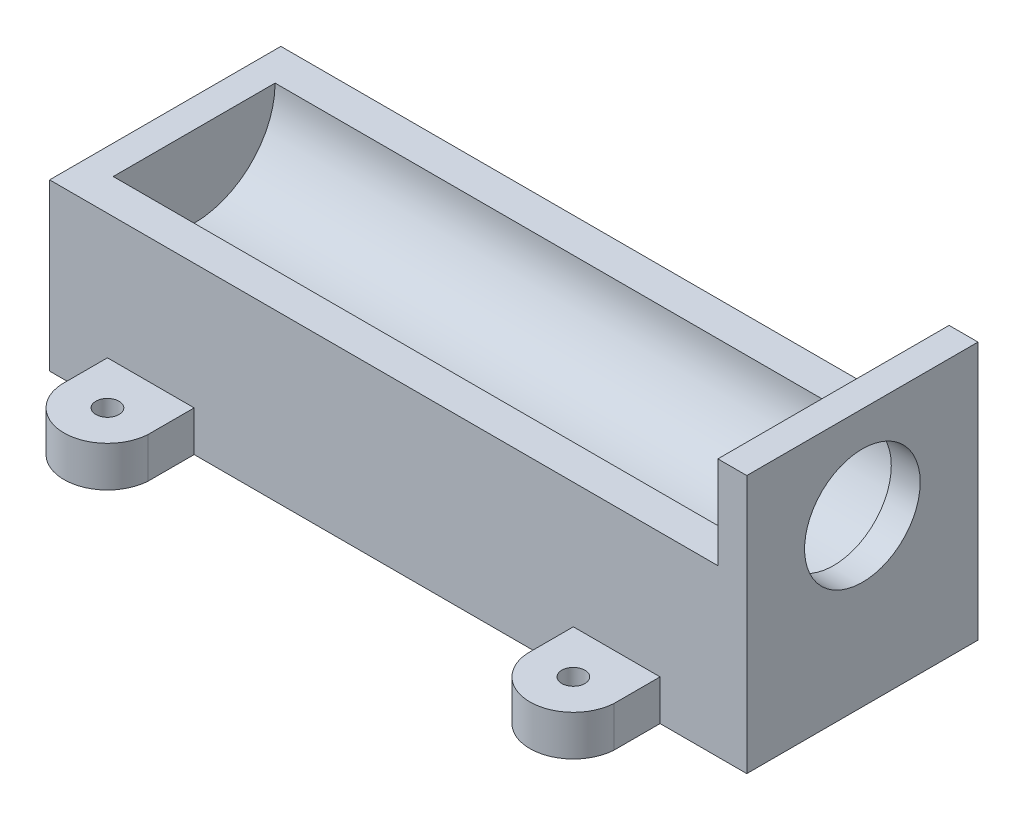
ISO-10303-21;
HEADER;
FILE_DESCRIPTION(('STEP AP214'),'2;1');
FILE_NAME('part.step','',(''),(''),'','','');
FILE_SCHEMA(('AUTOMOTIVE_DESIGN { 1 0 10303 214 1 1 1 1 }'));
ENDSEC;
DATA;
#1=APPLICATION_CONTEXT('core data for automotive mechanical design processes');
#2=APPLICATION_PROTOCOL_DEFINITION('international standard','automotive_design',2000,#1);
#3=PRODUCT_CONTEXT('',#1,'mechanical');
#4=PRODUCT('Part','Part','',(#3));
#5=PRODUCT_RELATED_PRODUCT_CATEGORY('part','',(#4));
#6=PRODUCT_DEFINITION_FORMATION('','',#4);
#7=PRODUCT_DEFINITION_CONTEXT('part definition',#1,'design');
#8=PRODUCT_DEFINITION('design','',#6,#7);
#9=PRODUCT_DEFINITION_SHAPE('','',#8);
#10=(LENGTH_UNIT() NAMED_UNIT(*) SI_UNIT(.MILLI.,.METRE.));
#11=(NAMED_UNIT(*) PLANE_ANGLE_UNIT() SI_UNIT($,.RADIAN.));
#12=(NAMED_UNIT(*) SI_UNIT($,.STERADIAN.) SOLID_ANGLE_UNIT());
#13=UNCERTAINTY_MEASURE_WITH_UNIT(LENGTH_MEASURE(1.E-05),#10,'distance_accuracy_value','');
#14=(GEOMETRIC_REPRESENTATION_CONTEXT(3) GLOBAL_UNCERTAINTY_ASSIGNED_CONTEXT((#13)) GLOBAL_UNIT_ASSIGNED_CONTEXT((#10,
#11,#12)) REPRESENTATION_CONTEXT('',''));
#15=CARTESIAN_POINT('',(0.,0.,0.));
#16=DIRECTION('',(0.,0.,1.));
#17=DIRECTION('',(1.,0.,0.));
#18=AXIS2_PLACEMENT_3D('',#15,#16,#17);
#19=CARTESIAN_POINT('',(55.3,0.,-20.));
#20=DIRECTION('',(0.,0.,1.));
#21=DIRECTION('',(1.,0.,0.));
#22=AXIS2_PLACEMENT_3D('',#19,#20,#21);
#23=PLANE('',#22);
#24=DIRECTION('',(0.,1.,0.));
#25=VECTOR('',#24,1.);
#26=CARTESIAN_POINT('',(-60.3,0.,-20.));
#27=LINE('',#26,#25);
#28=CARTESIAN_POINT('',(-60.3,-28.66,-20.));
#29=VERTEX_POINT('',#28);
#30=CARTESIAN_POINT('',(-60.3,0.,-20.));
#31=VERTEX_POINT('',#30);
#32=EDGE_CURVE('E404',#29,#31,#27,.T.);
#33=ORIENTED_EDGE('',*,*,#32,.T.);
#34=DIRECTION('',(-1.,0.,0.));
#35=VECTOR('',#34,1.);
#36=CARTESIAN_POINT('',(55.3,0.,-20.));
#37=LINE('',#36,#35);
#38=CARTESIAN_POINT('',(55.3,0.,-20.));
#39=VERTEX_POINT('',#38);
#40=EDGE_CURVE('E231',#39,#31,#37,.T.);
#41=ORIENTED_EDGE('',*,*,#40,.F.);
#42=DIRECTION('',(0.,1.,0.));
#43=VECTOR('',#42,1.);
#44=CARTESIAN_POINT('',(55.3,0.,-20.));
#45=LINE('',#44,#43);
#46=CARTESIAN_POINT('',(55.3,16.,-20.));
#47=VERTEX_POINT('',#46);
#48=EDGE_CURVE('E226',#39,#47,#45,.T.);
#49=ORIENTED_EDGE('',*,*,#48,.T.);
#50=DIRECTION('',(1.,0.,0.));
#51=VECTOR('',#50,1.);
#52=CARTESIAN_POINT('',(55.3,16.,-20.));
#53=LINE('',#52,#51);
#54=CARTESIAN_POINT('',(60.3,16.,-20.));
#55=VERTEX_POINT('',#54);
#56=EDGE_CURVE('E208',#47,#55,#53,.T.);
#57=ORIENTED_EDGE('',*,*,#56,.T.);
#58=DIRECTION('',(0.,1.,0.));
#59=VECTOR('',#58,1.);
#60=CARTESIAN_POINT('',(60.3,0.,-20.));
#61=LINE('',#60,#59);
#62=CARTESIAN_POINT('',(60.3,-28.66,-20.));
#63=VERTEX_POINT('',#62);
#64=EDGE_CURVE('E824',#63,#55,#61,.T.);
#65=ORIENTED_EDGE('',*,*,#64,.F.);
#66=DIRECTION('',(-1.,0.,0.));
#67=VECTOR('',#66,1.);
#68=CARTESIAN_POINT('',(101.449916160303,-28.66,-20.));
#69=LINE('',#68,#67);
#70=CARTESIAN_POINT('',(45.3,-28.66,-20.));
#71=VERTEX_POINT('',#70);
#72=EDGE_CURVE('E384',#63,#71,#69,.T.);
#73=ORIENTED_EDGE('',*,*,#72,.T.);
#74=DIRECTION('',(0.,-1.,0.));
#75=VECTOR('',#74,1.);
#76=CARTESIAN_POINT('',(45.3,-21.66,-20.));
#77=LINE('',#76,#75);
#78=CARTESIAN_POINT('',(45.3,-21.66,-20.));
#79=VERTEX_POINT('',#78);
#80=EDGE_CURVE('E304',#79,#71,#77,.T.);
#81=ORIENTED_EDGE('',*,*,#80,.F.);
#82=DIRECTION('',(1.,0.,0.));
#83=VECTOR('',#82,1.);
#84=CARTESIAN_POINT('',(0.,-21.66,-20.));
#85=LINE('',#84,#83);
#86=CARTESIAN_POINT('',(30.3,-21.66,-20.));
#87=VERTEX_POINT('',#86);
#88=EDGE_CURVE('E286',#87,#79,#85,.T.);
#89=ORIENTED_EDGE('',*,*,#88,.F.);
#90=DIRECTION('',(0.,-1.,0.));
#91=VECTOR('',#90,1.);
#92=CARTESIAN_POINT('',(30.3,-21.66,-20.));
#93=LINE('',#92,#91);
#94=CARTESIAN_POINT('',(30.3,-28.66,-20.));
#95=VERTEX_POINT('',#94);
#96=EDGE_CURVE('E259',#87,#95,#93,.T.);
#97=ORIENTED_EDGE('',*,*,#96,.T.);
#98=CARTESIAN_POINT('',(-35.3,-28.66,-20.));
#99=VERTEX_POINT('',#98);
#100=EDGE_CURVE('E391',#95,#99,#69,.T.);
#101=ORIENTED_EDGE('',*,*,#100,.T.);
#102=DIRECTION('',(0.,-1.,0.));
#103=VECTOR('',#102,1.);
#104=CARTESIAN_POINT('',(-35.3,-21.66,-20.));
#105=LINE('',#104,#103);
#106=CARTESIAN_POINT('',(-35.3,-21.66,-20.));
#107=VERTEX_POINT('',#106);
#108=EDGE_CURVE('E268',#107,#99,#105,.T.);
#109=ORIENTED_EDGE('',*,*,#108,.F.);
#110=DIRECTION('',(1.,0.,0.));
#111=VECTOR('',#110,1.);
#112=CARTESIAN_POINT('',(0.,-21.66,-20.));
#113=LINE('',#112,#111);
#114=CARTESIAN_POINT('',(-50.3,-21.66,-20.));
#115=VERTEX_POINT('',#114);
#116=EDGE_CURVE('E251',#115,#107,#113,.T.);
#117=ORIENTED_EDGE('',*,*,#116,.F.);
#118=DIRECTION('',(0.,-1.,0.));
#119=VECTOR('',#118,1.);
#120=CARTESIAN_POINT('',(-50.3,-21.66,-20.));
#121=LINE('',#120,#119);
#122=CARTESIAN_POINT('',(-50.3,-28.66,-20.));
#123=VERTEX_POINT('',#122);
#124=EDGE_CURVE('E264',#115,#123,#121,.T.);
#125=ORIENTED_EDGE('',*,*,#124,.T.);
#126=EDGE_CURVE('E379',#123,#29,#69,.T.);
#127=ORIENTED_EDGE('',*,*,#126,.T.);
#128=EDGE_LOOP('',(#33,#41,#49,#57,#65,#73,#81,#89,#97,#101,#109,#117,#125,#127));
#129=FACE_BOUND('',#128,.T.);
#130=ADVANCED_FACE('F46',(#129),#23,.F.);
#131=CARTESIAN_POINT('',(55.3,0.,20.));
#132=DIRECTION('',(0.,0.,1.));
#133=DIRECTION('',(1.,0.,0.));
#134=AXIS2_PLACEMENT_3D('',#131,#132,#133);
#135=PLANE('',#134);
#136=DIRECTION('',(0.,-1.,0.));
#137=VECTOR('',#136,1.);
#138=CARTESIAN_POINT('',(60.3,0.,20.));
#139=LINE('',#138,#137);
#140=CARTESIAN_POINT('',(60.3,16.,20.));
#141=VERTEX_POINT('',#140);
#142=CARTESIAN_POINT('',(60.3,-28.66,20.));
#143=VERTEX_POINT('',#142);
#144=EDGE_CURVE('E406',#141,#143,#139,.T.);
#145=ORIENTED_EDGE('',*,*,#144,.F.);
#146=DIRECTION('',(1.,0.,0.));
#147=VECTOR('',#146,1.);
#148=CARTESIAN_POINT('',(55.3,16.,20.));
#149=LINE('',#148,#147);
#150=CARTESIAN_POINT('',(55.3,16.,20.));
#151=VERTEX_POINT('',#150);
#152=EDGE_CURVE('E217',#151,#141,#149,.T.);
#153=ORIENTED_EDGE('',*,*,#152,.F.);
#154=DIRECTION('',(0.,-1.,0.));
#155=VECTOR('',#154,1.);
#156=CARTESIAN_POINT('',(55.3,0.,20.));
#157=LINE('',#156,#155);
#158=CARTESIAN_POINT('',(55.3,0.,20.));
#159=VERTEX_POINT('',#158);
#160=EDGE_CURVE('E228',#151,#159,#157,.T.);
#161=ORIENTED_EDGE('',*,*,#160,.T.);
#162=DIRECTION('',(-1.,0.,0.));
#163=VECTOR('',#162,1.);
#164=CARTESIAN_POINT('',(55.3,0.,20.));
#165=LINE('',#164,#163);
#166=CARTESIAN_POINT('',(-60.3,0.,20.));
#167=VERTEX_POINT('',#166);
#168=EDGE_CURVE('E55',#159,#167,#165,.T.);
#169=ORIENTED_EDGE('',*,*,#168,.T.);
#170=DIRECTION('',(0.,-1.,0.));
#171=VECTOR('',#170,1.);
#172=CARTESIAN_POINT('',(-60.3,0.,20.));
#173=LINE('',#172,#171);
#174=CARTESIAN_POINT('',(-60.3,-28.66,20.));
#175=VERTEX_POINT('',#174);
#176=EDGE_CURVE('E399',#167,#175,#173,.T.);
#177=ORIENTED_EDGE('',*,*,#176,.T.);
#178=DIRECTION('',(-1.,0.,0.));
#179=VECTOR('',#178,1.);
#180=CARTESIAN_POINT('',(101.449916160303,-28.66,20.));
#181=LINE('',#180,#179);
#182=CARTESIAN_POINT('',(-50.3,-28.66,20.));
#183=VERTEX_POINT('',#182);
#184=EDGE_CURVE('E383',#183,#175,#181,.T.);
#185=ORIENTED_EDGE('',*,*,#184,.F.);
#186=DIRECTION('',(0.,-1.,0.));
#187=VECTOR('',#186,1.);
#188=CARTESIAN_POINT('',(-50.3,-21.66,20.));
#189=LINE('',#188,#187);
#190=CARTESIAN_POINT('',(-50.3,-21.66,20.));
#191=VERTEX_POINT('',#190);
#192=EDGE_CURVE('E372',#191,#183,#189,.T.);
#193=ORIENTED_EDGE('',*,*,#192,.F.);
#194=DIRECTION('',(-1.,0.,0.));
#195=VECTOR('',#194,1.);
#196=CARTESIAN_POINT('',(0.,-21.66,20.));
#197=LINE('',#196,#195);
#198=CARTESIAN_POINT('',(-35.3,-21.66,20.));
#199=VERTEX_POINT('',#198);
#200=EDGE_CURVE('E348',#199,#191,#197,.T.);
#201=ORIENTED_EDGE('',*,*,#200,.F.);
#202=DIRECTION('',(0.,-1.,0.));
#203=VECTOR('',#202,1.);
#204=CARTESIAN_POINT('',(-35.3,-21.66,20.));
#205=LINE('',#204,#203);
#206=CARTESIAN_POINT('',(-35.3,-28.66,20.));
#207=VERTEX_POINT('',#206);
#208=EDGE_CURVE('E369',#199,#207,#205,.T.);
#209=ORIENTED_EDGE('',*,*,#208,.T.);
#210=CARTESIAN_POINT('',(30.3,-28.66,20.));
#211=VERTEX_POINT('',#210);
#212=EDGE_CURVE('E389',#211,#207,#181,.T.);
#213=ORIENTED_EDGE('',*,*,#212,.F.);
#214=DIRECTION('',(0.,-1.,0.));
#215=VECTOR('',#214,1.);
#216=CARTESIAN_POINT('',(30.3,-21.66,20.));
#217=LINE('',#216,#215);
#218=CARTESIAN_POINT('',(30.3,-21.66,20.));
#219=VERTEX_POINT('',#218);
#220=EDGE_CURVE('E338',#219,#211,#217,.T.);
#221=ORIENTED_EDGE('',*,*,#220,.F.);
#222=DIRECTION('',(-1.,0.,0.));
#223=VECTOR('',#222,1.);
#224=CARTESIAN_POINT('',(0.,-21.66,20.));
#225=LINE('',#224,#223);
#226=CARTESIAN_POINT('',(45.3,-21.66,20.));
#227=VERTEX_POINT('',#226);
#228=EDGE_CURVE('E315',#227,#219,#225,.T.);
#229=ORIENTED_EDGE('',*,*,#228,.F.);
#230=DIRECTION('',(0.,-1.,0.));
#231=VECTOR('',#230,1.);
#232=CARTESIAN_POINT('',(45.3,-21.66,20.));
#233=LINE('',#232,#231);
#234=CARTESIAN_POINT('',(45.3,-28.66,20.));
#235=VERTEX_POINT('',#234);
#236=EDGE_CURVE('E335',#227,#235,#233,.T.);
#237=ORIENTED_EDGE('',*,*,#236,.T.);
#238=EDGE_CURVE('E385',#143,#235,#181,.T.);
#239=ORIENTED_EDGE('',*,*,#238,.F.);
#240=EDGE_LOOP('',(#145,#153,#161,#169,#177,#185,#193,#201,#209,#213,#221,#229,#237,#239));
#241=FACE_BOUND('',#240,.T.);
#242=ADVANCED_FACE('F48',(#241),#135,.T.);
#243=CARTESIAN_POINT('',(55.3,0.,0.));
#244=DIRECTION('',(1.,0.,0.));
#245=DIRECTION('',(0.,0.,-1.));
#246=AXIS2_PLACEMENT_3D('',#243,#244,#245);
#247=PLANE('',#246);
#248=CARTESIAN_POINT('',(55.3,0.,0.));
#249=DIRECTION('',(1.,0.,0.));
#250=DIRECTION('',(0.,0.,-1.));
#251=AXIS2_PLACEMENT_3D('',#248,#249,#250);
#252=CIRCLE('',#251,14.);
#253=CARTESIAN_POINT('',(55.3,0.,-14.));
#254=VERTEX_POINT('',#253);
#255=CARTESIAN_POINT('',(55.3,0.,14.));
#256=VERTEX_POINT('',#255);
#257=EDGE_CURVE('E392',#254,#256,#252,.F.);
#258=ORIENTED_EDGE('',*,*,#257,.T.);
#259=DIRECTION('',(0.,0.,-1.));
#260=VECTOR('',#259,1.);
#261=CARTESIAN_POINT('',(55.3,0.,20.));
#262=LINE('',#261,#260);
#263=EDGE_CURVE('E218',#159,#256,#262,.T.);
#264=ORIENTED_EDGE('',*,*,#263,.F.);
#265=ORIENTED_EDGE('',*,*,#160,.F.);
#266=DIRECTION('',(0.,0.,1.));
#267=VECTOR('',#266,1.);
#268=CARTESIAN_POINT('',(55.3,16.,-20.));
#269=LINE('',#268,#267);
#270=EDGE_CURVE('E212',#47,#151,#269,.T.);
#271=ORIENTED_EDGE('',*,*,#270,.F.);
#272=ORIENTED_EDGE('',*,*,#48,.F.);
#273=DIRECTION('',(0.,0.,-1.));
#274=VECTOR('',#273,1.);
#275=CARTESIAN_POINT('',(55.3,0.,-20.));
#276=LINE('',#275,#274);
#277=EDGE_CURVE('E69',#254,#39,#276,.T.);
#278=ORIENTED_EDGE('',*,*,#277,.F.);
#279=EDGE_LOOP('',(#258,#264,#265,#271,#272,#278));
#280=FACE_BOUND('',#279,.T.);
#281=CARTESIAN_POINT('',(55.3,0.,0.));
#282=DIRECTION('',(1.,0.,0.));
#283=DIRECTION('',(0.,0.,-1.));
#284=AXIS2_PLACEMENT_3D('',#281,#282,#283);
#285=CIRCLE('',#284,10.);
#286=CARTESIAN_POINT('',(55.3,0.,-10.));
#287=VERTEX_POINT('',#286);
#288=EDGE_CURVE('E394',#287,#287,#285,.T.);
#289=ORIENTED_EDGE('',*,*,#288,.T.);
#290=EDGE_LOOP('',(#289));
#291=FACE_BOUND('',#290,.T.);
#292=ADVANCED_FACE('F224',(#280,#291),#247,.F.);
#293=CARTESIAN_POINT('',(-55.3,0.,0.));
#294=DIRECTION('',(-1.,0.,0.));
#295=DIRECTION('',(0.,0.,-1.));
#296=AXIS2_PLACEMENT_3D('',#293,#294,#295);
#297=PLANE('',#296);
#298=CARTESIAN_POINT('',(-55.3,0.,0.));
#299=DIRECTION('',(-1.,0.,0.));
#300=DIRECTION('',(0.,0.,-1.));
#301=AXIS2_PLACEMENT_3D('',#298,#299,#300);
#302=CIRCLE('',#301,14.);
#303=CARTESIAN_POINT('',(-55.3,0.,-14.));
#304=VERTEX_POINT('',#303);
#305=CARTESIAN_POINT('',(-55.3,0.,14.));
#306=VERTEX_POINT('',#305);
#307=EDGE_CURVE('E415',#304,#306,#302,.T.);
#308=ORIENTED_EDGE('',*,*,#307,.F.);
#309=DIRECTION('',(0.,0.,1.));
#310=VECTOR('',#309,1.);
#311=CARTESIAN_POINT('',(-55.3,0.,20.));
#312=LINE('',#311,#310);
#313=EDGE_CURVE('E398',#304,#306,#312,.T.);
#314=ORIENTED_EDGE('',*,*,#313,.T.);
#315=EDGE_LOOP('',(#308,#314));
#316=FACE_BOUND('',#315,.T.);
#317=ADVANCED_FACE('F431',(#316),#297,.F.);
#318=CARTESIAN_POINT('',(55.3,0.,0.));
#319=DIRECTION('',(0.,-1.,0.));
#320=DIRECTION('',(0.,0.,-1.));
#321=AXIS2_PLACEMENT_3D('',#318,#319,#320);
#322=PLANE('',#321);
#323=ORIENTED_EDGE('',*,*,#168,.F.);
#324=ORIENTED_EDGE('',*,*,#263,.T.);
#325=DIRECTION('',(-1.,0.,0.));
#326=VECTOR('',#325,1.);
#327=CARTESIAN_POINT('',(88.8410196624969,0.,14.));
#328=LINE('',#327,#326);
#329=EDGE_CURVE('E395',#256,#306,#328,.T.);
#330=ORIENTED_EDGE('',*,*,#329,.T.);
#331=ORIENTED_EDGE('',*,*,#313,.F.);
#332=DIRECTION('',(-1.,0.,0.));
#333=VECTOR('',#332,1.);
#334=CARTESIAN_POINT('',(88.8410196624969,0.,-14.));
#335=LINE('',#334,#333);
#336=EDGE_CURVE('E388',#254,#304,#335,.T.);
#337=ORIENTED_EDGE('',*,*,#336,.F.);
#338=ORIENTED_EDGE('',*,*,#277,.T.);
#339=ORIENTED_EDGE('',*,*,#40,.T.);
#340=DIRECTION('',(0.,0.,1.));
#341=VECTOR('',#340,1.);
#342=CARTESIAN_POINT('',(-60.3,0.,20.));
#343=LINE('',#342,#341);
#344=EDGE_CURVE('E402',#31,#167,#343,.T.);
#345=ORIENTED_EDGE('',*,*,#344,.T.);
#346=EDGE_LOOP('',(#323,#324,#330,#331,#337,#338,#339,#345));
#347=FACE_BOUND('',#346,.T.);
#348=ADVANCED_FACE('F425',(#347),#322,.F.);
#349=CARTESIAN_POINT('',(60.3,0.,0.));
#350=DIRECTION('',(1.,0.,0.));
#351=DIRECTION('',(0.,0.,-1.));
#352=AXIS2_PLACEMENT_3D('',#349,#350,#351);
#353=PLANE('',#352);
#354=DIRECTION('',(0.,0.,1.));
#355=VECTOR('',#354,1.);
#356=CARTESIAN_POINT('',(60.3,16.,-20.));
#357=LINE('',#356,#355);
#358=EDGE_CURVE('E214',#55,#141,#357,.T.);
#359=ORIENTED_EDGE('',*,*,#358,.T.);
#360=ORIENTED_EDGE('',*,*,#144,.T.);
#361=DIRECTION('',(0.,0.,1.));
#362=VECTOR('',#361,1.);
#363=CARTESIAN_POINT('',(60.3,-28.66,20.));
#364=LINE('',#363,#362);
#365=EDGE_CURVE('E380',#63,#143,#364,.T.);
#366=ORIENTED_EDGE('',*,*,#365,.F.);
#367=ORIENTED_EDGE('',*,*,#64,.T.);
#368=EDGE_LOOP('',(#359,#360,#366,#367));
#369=FACE_BOUND('',#368,.T.);
#370=CARTESIAN_POINT('',(60.3,0.,0.));
#371=DIRECTION('',(1.,0.,0.));
#372=DIRECTION('',(0.,0.,-1.));
#373=AXIS2_PLACEMENT_3D('',#370,#371,#372);
#374=CIRCLE('',#373,10.);
#375=CARTESIAN_POINT('',(60.3,0.,-10.));
#376=VERTEX_POINT('',#375);
#377=EDGE_CURVE('E11',#376,#376,#374,.T.);
#378=ORIENTED_EDGE('',*,*,#377,.F.);
#379=EDGE_LOOP('',(#378));
#380=FACE_BOUND('',#379,.T.);
#381=ADVANCED_FACE('F438',(#369,#380),#353,.T.);
#382=CARTESIAN_POINT('',(-60.3,0.,0.));
#383=DIRECTION('',(-1.,0.,0.));
#384=DIRECTION('',(0.,0.,-1.));
#385=AXIS2_PLACEMENT_3D('',#382,#383,#384);
#386=PLANE('',#385);
#387=ORIENTED_EDGE('',*,*,#176,.F.);
#388=ORIENTED_EDGE('',*,*,#344,.F.);
#389=ORIENTED_EDGE('',*,*,#32,.F.);
#390=DIRECTION('',(0.,0.,1.));
#391=VECTOR('',#390,1.);
#392=CARTESIAN_POINT('',(-60.3,-28.66,20.));
#393=LINE('',#392,#391);
#394=EDGE_CURVE('E368',#29,#175,#393,.T.);
#395=ORIENTED_EDGE('',*,*,#394,.T.);
#396=EDGE_LOOP('',(#387,#388,#389,#395));
#397=FACE_BOUND('',#396,.T.);
#398=ADVANCED_FACE('F451',(#397),#386,.T.);
#399=CARTESIAN_POINT('',(50.3,0.,0.));
#400=DIRECTION('',(1.,0.,0.));
#401=DIRECTION('',(0.,0.,-1.));
#402=AXIS2_PLACEMENT_3D('',#399,#400,#401);
#403=CYLINDRICAL_SURFACE('',#402,10.);
#404=ORIENTED_EDGE('',*,*,#288,.F.);
#405=EDGE_LOOP('',(#404));
#406=FACE_BOUND('',#405,.T.);
#407=ORIENTED_EDGE('',*,*,#377,.T.);
#408=EDGE_LOOP('',(#407));
#409=FACE_BOUND('',#408,.T.);
#410=ADVANCED_FACE('F456',(#406,#409),#403,.F.);
#411=CARTESIAN_POINT('',(88.8410196624969,0.,0.));
#412=DIRECTION('',(-1.,0.,0.));
#413=DIRECTION('',(0.,0.,1.));
#414=AXIS2_PLACEMENT_3D('',#411,#412,#413);
#415=CYLINDRICAL_SURFACE('',#414,14.);
#416=ORIENTED_EDGE('',*,*,#257,.F.);
#417=ORIENTED_EDGE('',*,*,#336,.T.);
#418=ORIENTED_EDGE('',*,*,#307,.T.);
#419=ORIENTED_EDGE('',*,*,#329,.F.);
#420=EDGE_LOOP('',(#416,#417,#418,#419));
#421=FACE_BOUND('',#420,.T.);
#422=ADVANCED_FACE('F429',(#421),#415,.F.);
#423=CARTESIAN_POINT('',(101.449916160303,-28.66,20.));
#424=DIRECTION('',(0.,-1.,0.));
#425=DIRECTION('',(0.,0.,-1.));
#426=AXIS2_PLACEMENT_3D('',#423,#424,#425);
#427=PLANE('',#426);
#428=CARTESIAN_POINT('',(-42.8,-28.66,-27.5));
#429=DIRECTION('',(0.,-1.,0.));
#430=DIRECTION('',(0.,0.,-1.));
#431=AXIS2_PLACEMENT_3D('',#428,#429,#430);
#432=CIRCLE('',#431,2.);
#433=CARTESIAN_POINT('',(-42.8,-28.66,-29.5));
#434=VERTEX_POINT('',#433);
#435=EDGE_CURVE('E238',#434,#434,#432,.T.);
#436=ORIENTED_EDGE('',*,*,#435,.F.);
#437=EDGE_LOOP('',(#436));
#438=FACE_BOUND('',#437,.T.);
#439=ORIENTED_EDGE('',*,*,#72,.F.);
#440=ORIENTED_EDGE('',*,*,#365,.T.);
#441=ORIENTED_EDGE('',*,*,#238,.T.);
#442=DIRECTION('',(0.,0.,1.));
#443=VECTOR('',#442,1.);
#444=CARTESIAN_POINT('',(45.3,-28.66,0.));
#445=LINE('',#444,#443);
#446=CARTESIAN_POINT('',(45.3,-28.66,28.));
#447=VERTEX_POINT('',#446);
#448=EDGE_CURVE('E329',#235,#447,#445,.T.);
#449=ORIENTED_EDGE('',*,*,#448,.T.);
#450=CARTESIAN_POINT('',(37.8,-28.66,27.5));
#451=DIRECTION('',(0.,-1.,0.));
#452=DIRECTION('',(0.,0.,-1.));
#453=AXIS2_PLACEMENT_3D('',#450,#451,#452);
#454=CIRCLE('',#453,7.51664818918645);
#455=CARTESIAN_POINT('',(30.3,-28.66,28.));
#456=VERTEX_POINT('',#455);
#457=EDGE_CURVE('E324',#456,#447,#454,.F.);
#458=ORIENTED_EDGE('',*,*,#457,.F.);
#459=DIRECTION('',(0.,0.,1.));
#460=VECTOR('',#459,1.);
#461=CARTESIAN_POINT('',(30.3,-28.66,0.));
#462=LINE('',#461,#460);
#463=EDGE_CURVE('E327',#211,#456,#462,.T.);
#464=ORIENTED_EDGE('',*,*,#463,.F.);
#465=ORIENTED_EDGE('',*,*,#212,.T.);
#466=DIRECTION('',(0.,0.,1.));
#467=VECTOR('',#466,1.);
#468=CARTESIAN_POINT('',(-35.3,-28.66,0.));
#469=LINE('',#468,#467);
#470=CARTESIAN_POINT('',(-35.3,-28.66,28.));
#471=VERTEX_POINT('',#470);
#472=EDGE_CURVE('E361',#207,#471,#469,.T.);
#473=ORIENTED_EDGE('',*,*,#472,.T.);
#474=CARTESIAN_POINT('',(-42.8,-28.66,27.5));
#475=DIRECTION('',(0.,-1.,0.));
#476=DIRECTION('',(0.,0.,-1.));
#477=AXIS2_PLACEMENT_3D('',#474,#475,#476);
#478=CIRCLE('',#477,7.51664818918645);
#479=CARTESIAN_POINT('',(-50.3,-28.66,28.));
#480=VERTEX_POINT('',#479);
#481=EDGE_CURVE('E267',#480,#471,#478,.F.);
#482=ORIENTED_EDGE('',*,*,#481,.F.);
#483=DIRECTION('',(0.,0.,1.));
#484=VECTOR('',#483,1.);
#485=CARTESIAN_POINT('',(-50.3,-28.66,0.));
#486=LINE('',#485,#484);
#487=EDGE_CURVE('E359',#183,#480,#486,.T.);
#488=ORIENTED_EDGE('',*,*,#487,.F.);
#489=ORIENTED_EDGE('',*,*,#184,.T.);
#490=ORIENTED_EDGE('',*,*,#394,.F.);
#491=ORIENTED_EDGE('',*,*,#126,.F.);
#492=DIRECTION('',(0.,0.,-1.));
#493=VECTOR('',#492,1.);
#494=CARTESIAN_POINT('',(-50.3,-28.66,0.));
#495=LINE('',#494,#493);
#496=CARTESIAN_POINT('',(-50.3,-28.66,-28.));
#497=VERTEX_POINT('',#496);
#498=EDGE_CURVE('E255',#123,#497,#495,.T.);
#499=ORIENTED_EDGE('',*,*,#498,.T.);
#500=CARTESIAN_POINT('',(-42.8,-28.66,-27.5));
#501=DIRECTION('',(0.,-1.,0.));
#502=DIRECTION('',(0.,0.,-1.));
#503=AXIS2_PLACEMENT_3D('',#500,#501,#502);
#504=CIRCLE('',#503,7.51664818918645);
#505=CARTESIAN_POINT('',(-35.3,-28.66,-27.9999999999999));
#506=VERTEX_POINT('',#505);
#507=EDGE_CURVE('E258',#497,#506,#504,.T.);
#508=ORIENTED_EDGE('',*,*,#507,.T.);
#509=DIRECTION('',(0.,0.,-1.));
#510=VECTOR('',#509,1.);
#511=CARTESIAN_POINT('',(-35.3,-28.66,0.));
#512=LINE('',#511,#510);
#513=EDGE_CURVE('E246',#99,#506,#512,.T.);
#514=ORIENTED_EDGE('',*,*,#513,.F.);
#515=ORIENTED_EDGE('',*,*,#100,.F.);
#516=DIRECTION('',(0.,0.,-1.));
#517=VECTOR('',#516,1.);
#518=CARTESIAN_POINT('',(30.3,-28.66,0.));
#519=LINE('',#518,#517);
#520=CARTESIAN_POINT('',(30.3,-28.66,-28.));
#521=VERTEX_POINT('',#520);
#522=EDGE_CURVE('E293',#95,#521,#519,.T.);
#523=ORIENTED_EDGE('',*,*,#522,.T.);
#524=CARTESIAN_POINT('',(37.8,-28.66,-27.5));
#525=DIRECTION('',(0.,-1.,0.));
#526=DIRECTION('',(0.,0.,-1.));
#527=AXIS2_PLACEMENT_3D('',#524,#525,#526);
#528=CIRCLE('',#527,7.51664818918646);
#529=CARTESIAN_POINT('',(45.3,-28.66,-28.));
#530=VERTEX_POINT('',#529);
#531=EDGE_CURVE('E297',#521,#530,#528,.T.);
#532=ORIENTED_EDGE('',*,*,#531,.T.);
#533=DIRECTION('',(0.,0.,-1.));
#534=VECTOR('',#533,1.);
#535=CARTESIAN_POINT('',(45.3,-28.66,0.));
#536=LINE('',#535,#534);
#537=EDGE_CURVE('E278',#71,#530,#536,.T.);
#538=ORIENTED_EDGE('',*,*,#537,.F.);
#539=EDGE_LOOP('',(#439,#440,#441,#449,#458,#464,#465,#473,#482,#488,#489,#490,#491,#499,#508,
#514,#515,#523,#532,#538));
#540=FACE_BOUND('',#539,.T.);
#541=CARTESIAN_POINT('',(-42.8,-28.66,27.5));
#542=DIRECTION('',(0.,-1.,0.));
#543=DIRECTION('',(0.,0.,-1.));
#544=AXIS2_PLACEMENT_3D('',#541,#542,#543);
#545=CIRCLE('',#544,2.003722313285);
#546=CARTESIAN_POINT('',(-42.8,-28.66,25.496277686715));
#547=VERTEX_POINT('',#546);
#548=EDGE_CURVE('E346',#547,#547,#545,.T.);
#549=ORIENTED_EDGE('',*,*,#548,.F.);
#550=EDGE_LOOP('',(#549));
#551=FACE_BOUND('',#550,.T.);
#552=CARTESIAN_POINT('',(37.8,-28.66,-27.5));
#553=DIRECTION('',(0.,-1.,0.));
#554=DIRECTION('',(0.,0.,-1.));
#555=AXIS2_PLACEMENT_3D('',#552,#553,#554);
#556=CIRCLE('',#555,2.);
#557=CARTESIAN_POINT('',(37.8,-28.66,-29.5));
#558=VERTEX_POINT('',#557);
#559=EDGE_CURVE('E290',#558,#558,#556,.F.);
#560=ORIENTED_EDGE('',*,*,#559,.T.);
#561=EDGE_LOOP('',(#560));
#562=FACE_BOUND('',#561,.T.);
#563=CARTESIAN_POINT('',(37.8,-28.66,27.5));
#564=DIRECTION('',(0.,-1.,0.));
#565=DIRECTION('',(0.,0.,-1.));
#566=AXIS2_PLACEMENT_3D('',#563,#564,#565);
#567=CIRCLE('',#566,2.);
#568=CARTESIAN_POINT('',(37.8,-28.66,25.5));
#569=VERTEX_POINT('',#568);
#570=EDGE_CURVE('E313',#569,#569,#567,.T.);
#571=ORIENTED_EDGE('',*,*,#570,.F.);
#572=EDGE_LOOP('',(#571));
#573=FACE_BOUND('',#572,.T.);
#574=ADVANCED_FACE('F466',(#438,#540,#551,#562,#573),#427,.T.);
#575=CARTESIAN_POINT('',(-42.8,-21.66,27.5));
#576=DIRECTION('',(0.,-1.,0.));
#577=DIRECTION('',(0.,0.,-1.));
#578=AXIS2_PLACEMENT_3D('',#575,#576,#577);
#579=CYLINDRICAL_SURFACE('',#578,7.51664818918645);
#580=ORIENTED_EDGE('',*,*,#481,.T.);
#581=DIRECTION('',(0.,-1.,0.));
#582=VECTOR('',#581,1.);
#583=CARTESIAN_POINT('',(-35.3,-21.66,28.));
#584=LINE('',#583,#582);
#585=CARTESIAN_POINT('',(-35.3,-21.66,28.));
#586=VERTEX_POINT('',#585);
#587=EDGE_CURVE('E366',#586,#471,#584,.T.);
#588=ORIENTED_EDGE('',*,*,#587,.F.);
#589=CARTESIAN_POINT('',(-42.8,-21.66,27.5));
#590=DIRECTION('',(0.,-1.,0.));
#591=DIRECTION('',(0.,0.,-1.));
#592=AXIS2_PLACEMENT_3D('',#589,#590,#591);
#593=CIRCLE('',#592,7.51664818918645);
#594=CARTESIAN_POINT('',(-50.3,-21.66,28.));
#595=VERTEX_POINT('',#594);
#596=EDGE_CURVE('E343',#595,#586,#593,.F.);
#597=ORIENTED_EDGE('',*,*,#596,.F.);
#598=DIRECTION('',(0.,-1.,0.));
#599=VECTOR('',#598,1.);
#600=CARTESIAN_POINT('',(-50.3,-21.66,28.));
#601=LINE('',#600,#599);
#602=EDGE_CURVE('E356',#595,#480,#601,.T.);
#603=ORIENTED_EDGE('',*,*,#602,.T.);
#604=EDGE_LOOP('',(#580,#588,#597,#603));
#605=FACE_BOUND('',#604,.T.);
#606=ADVANCED_FACE('F472',(#605),#579,.T.);
#607=CARTESIAN_POINT('',(-35.3,-21.66,0.));
#608=DIRECTION('',(1.,0.,0.));
#609=DIRECTION('',(0.,0.,-1.));
#610=AXIS2_PLACEMENT_3D('',#607,#608,#609);
#611=PLANE('',#610);
#612=ORIENTED_EDGE('',*,*,#472,.F.);
#613=ORIENTED_EDGE('',*,*,#208,.F.);
#614=DIRECTION('',(0.,0.,1.));
#615=VECTOR('',#614,1.);
#616=CARTESIAN_POINT('',(-35.3,-21.66,0.));
#617=LINE('',#616,#615);
#618=EDGE_CURVE('E350',#199,#586,#617,.T.);
#619=ORIENTED_EDGE('',*,*,#618,.T.);
#620=ORIENTED_EDGE('',*,*,#587,.T.);
#621=EDGE_LOOP('',(#612,#613,#619,#620));
#622=FACE_BOUND('',#621,.T.);
#623=ADVANCED_FACE('F476',(#622),#611,.T.);
#624=CARTESIAN_POINT('',(-50.3,-21.66,0.));
#625=DIRECTION('',(1.,0.,0.));
#626=DIRECTION('',(0.,0.,-1.));
#627=AXIS2_PLACEMENT_3D('',#624,#625,#626);
#628=PLANE('',#627);
#629=ORIENTED_EDGE('',*,*,#487,.T.);
#630=ORIENTED_EDGE('',*,*,#602,.F.);
#631=DIRECTION('',(0.,0.,1.));
#632=VECTOR('',#631,1.);
#633=CARTESIAN_POINT('',(-50.3,-21.66,0.));
#634=LINE('',#633,#632);
#635=EDGE_CURVE('E345',#191,#595,#634,.T.);
#636=ORIENTED_EDGE('',*,*,#635,.F.);
#637=ORIENTED_EDGE('',*,*,#192,.T.);
#638=EDGE_LOOP('',(#629,#630,#636,#637));
#639=FACE_BOUND('',#638,.T.);
#640=ADVANCED_FACE('F478',(#639),#628,.F.);
#641=CARTESIAN_POINT('',(-42.8,-21.66,27.5));
#642=DIRECTION('',(0.,-1.,0.));
#643=DIRECTION('',(0.,0.,-1.));
#644=AXIS2_PLACEMENT_3D('',#641,#642,#643);
#645=CYLINDRICAL_SURFACE('',#644,2.003722313285);
#646=CARTESIAN_POINT('',(-42.8,-21.66,27.5));
#647=DIRECTION('',(0.,-1.,0.));
#648=DIRECTION('',(0.,0.,-1.));
#649=AXIS2_PLACEMENT_3D('',#646,#647,#648);
#650=CIRCLE('',#649,2.003722313285);
#651=CARTESIAN_POINT('',(-42.8,-21.66,25.496277686715));
#652=VERTEX_POINT('',#651);
#653=EDGE_CURVE('E353',#652,#652,#650,.T.);
#654=ORIENTED_EDGE('',*,*,#653,.F.);
#655=EDGE_LOOP('',(#654));
#656=FACE_BOUND('',#655,.T.);
#657=ORIENTED_EDGE('',*,*,#548,.T.);
#658=EDGE_LOOP('',(#657));
#659=FACE_BOUND('',#658,.T.);
#660=ADVANCED_FACE('F481',(#656,#659),#645,.F.);
#661=CARTESIAN_POINT('',(0.,-21.66,0.));
#662=DIRECTION('',(0.,-1.,0.));
#663=DIRECTION('',(0.,0.,-1.));
#664=AXIS2_PLACEMENT_3D('',#661,#662,#663);
#665=PLANE('',#664);
#666=ORIENTED_EDGE('',*,*,#596,.T.);
#667=ORIENTED_EDGE('',*,*,#618,.F.);
#668=ORIENTED_EDGE('',*,*,#200,.T.);
#669=ORIENTED_EDGE('',*,*,#635,.T.);
#670=EDGE_LOOP('',(#666,#667,#668,#669));
#671=FACE_BOUND('',#670,.T.);
#672=ORIENTED_EDGE('',*,*,#653,.T.);
#673=EDGE_LOOP('',(#672));
#674=FACE_BOUND('',#673,.T.);
#675=ADVANCED_FACE('F488',(#671,#674),#665,.F.);
#676=CARTESIAN_POINT('',(-50.3,-21.66,0.));
#677=DIRECTION('',(-1.,0.,0.));
#678=DIRECTION('',(0.,0.,1.));
#679=AXIS2_PLACEMENT_3D('',#676,#677,#678);
#680=PLANE('',#679);
#681=ORIENTED_EDGE('',*,*,#498,.F.);
#682=ORIENTED_EDGE('',*,*,#124,.F.);
#683=DIRECTION('',(0.,0.,-1.));
#684=VECTOR('',#683,1.);
#685=CARTESIAN_POINT('',(-50.3,-21.66,0.));
#686=LINE('',#685,#684);
#687=CARTESIAN_POINT('',(-50.3,-21.66,-28.));
#688=VERTEX_POINT('',#687);
#689=EDGE_CURVE('E242',#115,#688,#686,.T.);
#690=ORIENTED_EDGE('',*,*,#689,.T.);
#691=DIRECTION('',(0.,-1.,0.));
#692=VECTOR('',#691,1.);
#693=CARTESIAN_POINT('',(-50.3,-21.66,-28.));
#694=LINE('',#693,#692);
#695=EDGE_CURVE('E254',#688,#497,#694,.T.);
#696=ORIENTED_EDGE('',*,*,#695,.T.);
#697=EDGE_LOOP('',(#681,#682,#690,#696));
#698=FACE_BOUND('',#697,.T.);
#699=ADVANCED_FACE('F492',(#698),#680,.T.);
#700=CARTESIAN_POINT('',(-35.3,-21.66,0.));
#701=DIRECTION('',(-1.,0.,0.));
#702=DIRECTION('',(0.,0.,1.));
#703=AXIS2_PLACEMENT_3D('',#700,#701,#702);
#704=PLANE('',#703);
#705=ORIENTED_EDGE('',*,*,#513,.T.);
#706=DIRECTION('',(0.,-1.,0.));
#707=VECTOR('',#706,1.);
#708=CARTESIAN_POINT('',(-35.3,-21.66,-27.9999999999999));
#709=LINE('',#708,#707);
#710=CARTESIAN_POINT('',(-35.3,-21.66,-27.9999999999999));
#711=VERTEX_POINT('',#710);
#712=EDGE_CURVE('E271',#711,#506,#709,.T.);
#713=ORIENTED_EDGE('',*,*,#712,.F.);
#714=DIRECTION('',(0.,0.,-1.));
#715=VECTOR('',#714,1.);
#716=CARTESIAN_POINT('',(-35.3,-21.66,0.));
#717=LINE('',#716,#715);
#718=EDGE_CURVE('E249',#107,#711,#717,.T.);
#719=ORIENTED_EDGE('',*,*,#718,.F.);
#720=ORIENTED_EDGE('',*,*,#108,.T.);
#721=EDGE_LOOP('',(#705,#713,#719,#720));
#722=FACE_BOUND('',#721,.T.);
#723=ADVANCED_FACE('F538',(#722),#704,.F.);
#724=CARTESIAN_POINT('',(-42.8,-21.66,-27.5));
#725=DIRECTION('',(0.,-1.,0.));
#726=DIRECTION('',(0.,0.,-1.));
#727=AXIS2_PLACEMENT_3D('',#724,#725,#726);
#728=CYLINDRICAL_SURFACE('',#727,7.51664818918645);
#729=ORIENTED_EDGE('',*,*,#507,.F.);
#730=ORIENTED_EDGE('',*,*,#695,.F.);
#731=CARTESIAN_POINT('',(-42.8,-21.66,-27.5));
#732=DIRECTION('',(0.,-1.,0.));
#733=DIRECTION('',(0.,0.,-1.));
#734=AXIS2_PLACEMENT_3D('',#731,#732,#733);
#735=CIRCLE('',#734,7.51664818918645);
#736=EDGE_CURVE('E245',#688,#711,#735,.T.);
#737=ORIENTED_EDGE('',*,*,#736,.T.);
#738=ORIENTED_EDGE('',*,*,#712,.T.);
#739=EDGE_LOOP('',(#729,#730,#737,#738));
#740=FACE_BOUND('',#739,.T.);
#741=ADVANCED_FACE('F540',(#740),#728,.T.);
#742=CARTESIAN_POINT('',(0.,-21.66,0.));
#743=DIRECTION('',(0.,-1.,0.));
#744=DIRECTION('',(0.,0.,-1.));
#745=AXIS2_PLACEMENT_3D('',#742,#743,#744);
#746=PLANE('',#745);
#747=CARTESIAN_POINT('',(-42.8,-21.66,-27.5));
#748=DIRECTION('',(0.,-1.,0.));
#749=DIRECTION('',(0.,0.,-1.));
#750=AXIS2_PLACEMENT_3D('',#747,#748,#749);
#751=CIRCLE('',#750,2.);
#752=CARTESIAN_POINT('',(-42.8,-21.66,-29.5));
#753=VERTEX_POINT('',#752);
#754=EDGE_CURVE('E50',#753,#753,#751,.T.);
#755=ORIENTED_EDGE('',*,*,#754,.T.);
#756=EDGE_LOOP('',(#755));
#757=FACE_BOUND('',#756,.T.);
#758=ORIENTED_EDGE('',*,*,#689,.F.);
#759=ORIENTED_EDGE('',*,*,#116,.T.);
#760=ORIENTED_EDGE('',*,*,#718,.T.);
#761=ORIENTED_EDGE('',*,*,#736,.F.);
#762=EDGE_LOOP('',(#758,#759,#760,#761));
#763=FACE_BOUND('',#762,.T.);
#764=ADVANCED_FACE('F525',(#757,#763),#746,.F.);
#765=CARTESIAN_POINT('',(30.3,-21.66,0.));
#766=DIRECTION('',(-1.,0.,0.));
#767=DIRECTION('',(0.,0.,1.));
#768=AXIS2_PLACEMENT_3D('',#765,#766,#767);
#769=PLANE('',#768);
#770=ORIENTED_EDGE('',*,*,#522,.F.);
#771=ORIENTED_EDGE('',*,*,#96,.F.);
#772=DIRECTION('',(0.,0.,-1.));
#773=VECTOR('',#772,1.);
#774=CARTESIAN_POINT('',(30.3,-21.66,0.));
#775=LINE('',#774,#773);
#776=CARTESIAN_POINT('',(30.3,-21.66,-28.));
#777=VERTEX_POINT('',#776);
#778=EDGE_CURVE('E277',#87,#777,#775,.T.);
#779=ORIENTED_EDGE('',*,*,#778,.T.);
#780=DIRECTION('',(0.,-1.,0.));
#781=VECTOR('',#780,1.);
#782=CARTESIAN_POINT('',(30.3,-21.66,-28.));
#783=LINE('',#782,#781);
#784=EDGE_CURVE('E289',#777,#521,#783,.T.);
#785=ORIENTED_EDGE('',*,*,#784,.T.);
#786=EDGE_LOOP('',(#770,#771,#779,#785));
#787=FACE_BOUND('',#786,.T.);
#788=ADVANCED_FACE('F522',(#787),#769,.T.);
#789=CARTESIAN_POINT('',(45.3,-21.66,0.));
#790=DIRECTION('',(-1.,0.,0.));
#791=DIRECTION('',(0.,0.,1.));
#792=AXIS2_PLACEMENT_3D('',#789,#790,#791);
#793=PLANE('',#792);
#794=ORIENTED_EDGE('',*,*,#537,.T.);
#795=DIRECTION('',(0.,-1.,0.));
#796=VECTOR('',#795,1.);
#797=CARTESIAN_POINT('',(45.3,-21.66,-28.));
#798=LINE('',#797,#796);
#799=CARTESIAN_POINT('',(45.3,-21.66,-28.));
#800=VERTEX_POINT('',#799);
#801=EDGE_CURVE('E307',#800,#530,#798,.T.);
#802=ORIENTED_EDGE('',*,*,#801,.F.);
#803=DIRECTION('',(0.,0.,-1.));
#804=VECTOR('',#803,1.);
#805=CARTESIAN_POINT('',(45.3,-21.66,0.));
#806=LINE('',#805,#804);
#807=EDGE_CURVE('E284',#79,#800,#806,.T.);
#808=ORIENTED_EDGE('',*,*,#807,.F.);
#809=ORIENTED_EDGE('',*,*,#80,.T.);
#810=EDGE_LOOP('',(#794,#802,#808,#809));
#811=FACE_BOUND('',#810,.T.);
#812=ADVANCED_FACE('F520',(#811),#793,.F.);
#813=CARTESIAN_POINT('',(37.8,-21.66,-27.5));
#814=DIRECTION('',(0.,-1.,0.));
#815=DIRECTION('',(0.,0.,-1.));
#816=AXIS2_PLACEMENT_3D('',#813,#814,#815);
#817=CYLINDRICAL_SURFACE('',#816,2.);
#818=CARTESIAN_POINT('',(37.8,-21.66,-27.5));
#819=DIRECTION('',(0.,-1.,0.));
#820=DIRECTION('',(0.,0.,-1.));
#821=AXIS2_PLACEMENT_3D('',#818,#819,#820);
#822=CIRCLE('',#821,2.);
#823=CARTESIAN_POINT('',(37.8,-21.66,-29.5));
#824=VERTEX_POINT('',#823);
#825=EDGE_CURVE('E274',#824,#824,#822,.F.);
#826=ORIENTED_EDGE('',*,*,#825,.T.);
#827=EDGE_LOOP('',(#826));
#828=FACE_BOUND('',#827,.T.);
#829=ORIENTED_EDGE('',*,*,#559,.F.);
#830=EDGE_LOOP('',(#829));
#831=FACE_BOUND('',#830,.T.);
#832=ADVANCED_FACE('F516',(#828,#831),#817,.F.);
#833=CARTESIAN_POINT('',(37.8,-21.66,-27.5));
#834=DIRECTION('',(0.,-1.,0.));
#835=DIRECTION('',(0.,0.,-1.));
#836=AXIS2_PLACEMENT_3D('',#833,#834,#835);
#837=CYLINDRICAL_SURFACE('',#836,7.51664818918646);
#838=ORIENTED_EDGE('',*,*,#531,.F.);
#839=ORIENTED_EDGE('',*,*,#784,.F.);
#840=CARTESIAN_POINT('',(37.8,-21.66,-27.5));
#841=DIRECTION('',(0.,-1.,0.));
#842=DIRECTION('',(0.,0.,-1.));
#843=AXIS2_PLACEMENT_3D('',#840,#841,#842);
#844=CIRCLE('',#843,7.51664818918646);
#845=EDGE_CURVE('E281',#777,#800,#844,.T.);
#846=ORIENTED_EDGE('',*,*,#845,.T.);
#847=ORIENTED_EDGE('',*,*,#801,.T.);
#848=EDGE_LOOP('',(#838,#839,#846,#847));
#849=FACE_BOUND('',#848,.T.);
#850=ADVANCED_FACE('F519',(#849),#837,.T.);
#851=CARTESIAN_POINT('',(0.,-21.66,0.));
#852=DIRECTION('',(0.,-1.,0.));
#853=DIRECTION('',(0.,0.,-1.));
#854=AXIS2_PLACEMENT_3D('',#851,#852,#853);
#855=PLANE('',#854);
#856=ORIENTED_EDGE('',*,*,#825,.F.);
#857=EDGE_LOOP('',(#856));
#858=FACE_BOUND('',#857,.T.);
#859=ORIENTED_EDGE('',*,*,#778,.F.);
#860=ORIENTED_EDGE('',*,*,#88,.T.);
#861=ORIENTED_EDGE('',*,*,#807,.T.);
#862=ORIENTED_EDGE('',*,*,#845,.F.);
#863=EDGE_LOOP('',(#859,#860,#861,#862));
#864=FACE_BOUND('',#863,.T.);
#865=ADVANCED_FACE('F498',(#858,#864),#855,.F.);
#866=CARTESIAN_POINT('',(37.8,-21.66,27.5));
#867=DIRECTION('',(0.,-1.,0.));
#868=DIRECTION('',(0.,0.,-1.));
#869=AXIS2_PLACEMENT_3D('',#866,#867,#868);
#870=CYLINDRICAL_SURFACE('',#869,7.51664818918645);
#871=ORIENTED_EDGE('',*,*,#457,.T.);
#872=DIRECTION('',(0.,-1.,0.));
#873=VECTOR('',#872,1.);
#874=CARTESIAN_POINT('',(45.3,-21.66,28.));
#875=LINE('',#874,#873);
#876=CARTESIAN_POINT('',(45.3,-21.66,28.));
#877=VERTEX_POINT('',#876);
#878=EDGE_CURVE('E294',#877,#447,#875,.T.);
#879=ORIENTED_EDGE('',*,*,#878,.F.);
#880=CARTESIAN_POINT('',(37.8,-21.66,27.5));
#881=DIRECTION('',(0.,-1.,0.));
#882=DIRECTION('',(0.,0.,-1.));
#883=AXIS2_PLACEMENT_3D('',#880,#881,#882);
#884=CIRCLE('',#883,7.51664818918645);
#885=CARTESIAN_POINT('',(30.3,-21.66,28.));
#886=VERTEX_POINT('',#885);
#887=EDGE_CURVE('E310',#886,#877,#884,.F.);
#888=ORIENTED_EDGE('',*,*,#887,.F.);
#889=DIRECTION('',(0.,-1.,0.));
#890=VECTOR('',#889,1.);
#891=CARTESIAN_POINT('',(30.3,-21.66,28.));
#892=LINE('',#891,#890);
#893=EDGE_CURVE('E323',#886,#456,#892,.T.);
#894=ORIENTED_EDGE('',*,*,#893,.T.);
#895=EDGE_LOOP('',(#871,#879,#888,#894));
#896=FACE_BOUND('',#895,.T.);
#897=ADVANCED_FACE('F494',(#896),#870,.T.);
#898=CARTESIAN_POINT('',(45.3,-21.66,0.));
#899=DIRECTION('',(1.,0.,0.));
#900=DIRECTION('',(0.,0.,-1.));
#901=AXIS2_PLACEMENT_3D('',#898,#899,#900);
#902=PLANE('',#901);
#903=ORIENTED_EDGE('',*,*,#448,.F.);
#904=ORIENTED_EDGE('',*,*,#236,.F.);
#905=DIRECTION('',(0.,0.,1.));
#906=VECTOR('',#905,1.);
#907=CARTESIAN_POINT('',(45.3,-21.66,0.));
#908=LINE('',#907,#906);
#909=EDGE_CURVE('E317',#227,#877,#908,.T.);
#910=ORIENTED_EDGE('',*,*,#909,.T.);
#911=ORIENTED_EDGE('',*,*,#878,.T.);
#912=EDGE_LOOP('',(#903,#904,#910,#911));
#913=FACE_BOUND('',#912,.T.);
#914=ADVANCED_FACE('F497',(#913),#902,.T.);
#915=CARTESIAN_POINT('',(30.3,-21.66,0.));
#916=DIRECTION('',(1.,0.,0.));
#917=DIRECTION('',(0.,0.,-1.));
#918=AXIS2_PLACEMENT_3D('',#915,#916,#917);
#919=PLANE('',#918);
#920=ORIENTED_EDGE('',*,*,#463,.T.);
#921=ORIENTED_EDGE('',*,*,#893,.F.);
#922=DIRECTION('',(0.,0.,1.));
#923=VECTOR('',#922,1.);
#924=CARTESIAN_POINT('',(30.3,-21.66,0.));
#925=LINE('',#924,#923);
#926=EDGE_CURVE('E312',#219,#886,#925,.T.);
#927=ORIENTED_EDGE('',*,*,#926,.F.);
#928=ORIENTED_EDGE('',*,*,#220,.T.);
#929=EDGE_LOOP('',(#920,#921,#927,#928));
#930=FACE_BOUND('',#929,.T.);
#931=ADVANCED_FACE('F500',(#930),#919,.F.);
#932=CARTESIAN_POINT('',(37.8,-21.66,27.5));
#933=DIRECTION('',(0.,-1.,0.));
#934=DIRECTION('',(0.,0.,-1.));
#935=AXIS2_PLACEMENT_3D('',#932,#933,#934);
#936=CYLINDRICAL_SURFACE('',#935,2.);
#937=CARTESIAN_POINT('',(37.8,-21.66,27.5));
#938=DIRECTION('',(0.,-1.,0.));
#939=DIRECTION('',(0.,0.,-1.));
#940=AXIS2_PLACEMENT_3D('',#937,#938,#939);
#941=CIRCLE('',#940,2.);
#942=CARTESIAN_POINT('',(37.8,-21.66,25.5));
#943=VERTEX_POINT('',#942);
#944=EDGE_CURVE('E320',#943,#943,#941,.T.);
#945=ORIENTED_EDGE('',*,*,#944,.F.);
#946=EDGE_LOOP('',(#945));
#947=FACE_BOUND('',#946,.T.);
#948=ORIENTED_EDGE('',*,*,#570,.T.);
#949=EDGE_LOOP('',(#948));
#950=FACE_BOUND('',#949,.T.);
#951=ADVANCED_FACE('F503',(#947,#950),#936,.F.);
#952=CARTESIAN_POINT('',(0.,-21.66,0.));
#953=DIRECTION('',(0.,-1.,0.));
#954=DIRECTION('',(0.,0.,-1.));
#955=AXIS2_PLACEMENT_3D('',#952,#953,#954);
#956=PLANE('',#955);
#957=ORIENTED_EDGE('',*,*,#887,.T.);
#958=ORIENTED_EDGE('',*,*,#909,.F.);
#959=ORIENTED_EDGE('',*,*,#228,.T.);
#960=ORIENTED_EDGE('',*,*,#926,.T.);
#961=EDGE_LOOP('',(#957,#958,#959,#960));
#962=FACE_BOUND('',#961,.T.);
#963=ORIENTED_EDGE('',*,*,#944,.T.);
#964=EDGE_LOOP('',(#963));
#965=FACE_BOUND('',#964,.T.);
#966=ADVANCED_FACE('F510',(#962,#965),#956,.F.);
#967=CARTESIAN_POINT('',(-42.8,-8.66,-27.5));
#968=DIRECTION('',(0.,-1.,0.));
#969=DIRECTION('',(0.,0.,-1.));
#970=AXIS2_PLACEMENT_3D('',#967,#968,#969);
#971=CYLINDRICAL_SURFACE('',#970,2.);
#972=CARTESIAN_POINT('',(-42.8,-28.66,-29.5));
#973=CARTESIAN_POINT('',(-42.8,-28.5870833333333,-29.5));
#974=CARTESIAN_POINT('',(-42.8,-28.5141666666667,-29.5));
#975=CARTESIAN_POINT('',(-42.8,-28.3683333333333,-29.5));
#976=CARTESIAN_POINT('',(-42.8,-28.2954166666667,-29.5));
#977=CARTESIAN_POINT('',(-42.8,-28.1495833333333,-29.5));
#978=CARTESIAN_POINT('',(-42.8,-28.0766666666667,-29.5));
#979=CARTESIAN_POINT('',(-42.8,-27.9308333333333,-29.5));
#980=CARTESIAN_POINT('',(-42.8,-27.8579166666667,-29.5));
#981=CARTESIAN_POINT('',(-42.8,-27.7120833333333,-29.5));
#982=CARTESIAN_POINT('',(-42.8,-27.6391666666667,-29.5));
#983=CARTESIAN_POINT('',(-42.8,-27.4933333333333,-29.5));
#984=CARTESIAN_POINT('',(-42.8,-27.4204166666667,-29.5));
#985=CARTESIAN_POINT('',(-42.8,-27.2745833333333,-29.5));
#986=CARTESIAN_POINT('',(-42.8,-27.2016666666667,-29.5));
#987=CARTESIAN_POINT('',(-42.8,-27.0558333333333,-29.5));
#988=CARTESIAN_POINT('',(-42.8,-26.9829166666667,-29.5));
#989=CARTESIAN_POINT('',(-42.8,-26.8370833333333,-29.5));
#990=CARTESIAN_POINT('',(-42.8,-26.7641666666667,-29.5));
#991=CARTESIAN_POINT('',(-42.8,-26.6183333333333,-29.5));
#992=CARTESIAN_POINT('',(-42.8,-26.5454166666667,-29.5));
#993=CARTESIAN_POINT('',(-42.8,-26.3995833333333,-29.5));
#994=CARTESIAN_POINT('',(-42.8,-26.3266666666667,-29.5));
#995=CARTESIAN_POINT('',(-42.8,-26.1808333333333,-29.5));
#996=CARTESIAN_POINT('',(-42.8,-26.1079166666667,-29.5));
#997=CARTESIAN_POINT('',(-42.8,-25.9620833333333,-29.5));
#998=CARTESIAN_POINT('',(-42.8,-25.8891666666667,-29.5));
#999=CARTESIAN_POINT('',(-42.8,-25.7433333333333,-29.5));
#1000=CARTESIAN_POINT('',(-42.8,-25.6704166666667,-29.5));
#1001=CARTESIAN_POINT('',(-42.8,-25.5245833333333,-29.5));
#1002=CARTESIAN_POINT('',(-42.8,-25.4516666666667,-29.5));
#1003=CARTESIAN_POINT('',(-42.8,-25.3058333333333,-29.5));
#1004=CARTESIAN_POINT('',(-42.8,-25.2329166666667,-29.5));
#1005=CARTESIAN_POINT('',(-42.8,-25.0870833333333,-29.5));
#1006=CARTESIAN_POINT('',(-42.8,-25.0141666666667,-29.5));
#1007=CARTESIAN_POINT('',(-42.8,-24.8683333333333,-29.5));
#1008=CARTESIAN_POINT('',(-42.8,-24.7954166666667,-29.5));
#1009=CARTESIAN_POINT('',(-42.8,-24.6495833333333,-29.5));
#1010=CARTESIAN_POINT('',(-42.8,-24.5766666666667,-29.5));
#1011=CARTESIAN_POINT('',(-42.8,-24.4308333333333,-29.5));
#1012=CARTESIAN_POINT('',(-42.8,-24.3579166666667,-29.5));
#1013=CARTESIAN_POINT('',(-42.8,-24.2120833333333,-29.5));
#1014=CARTESIAN_POINT('',(-42.8,-24.1391666666667,-29.5));
#1015=CARTESIAN_POINT('',(-42.8,-23.9933333333333,-29.5));
#1016=CARTESIAN_POINT('',(-42.8,-23.9204166666667,-29.5));
#1017=CARTESIAN_POINT('',(-42.8,-23.7745833333333,-29.5));
#1018=CARTESIAN_POINT('',(-42.8,-23.7016666666667,-29.5));
#1019=CARTESIAN_POINT('',(-42.8,-23.5558333333333,-29.5));
#1020=CARTESIAN_POINT('',(-42.8,-23.4829166666667,-29.5));
#1021=CARTESIAN_POINT('',(-42.8,-23.3370833333333,-29.5));
#1022=CARTESIAN_POINT('',(-42.8,-23.2641666666667,-29.5));
#1023=CARTESIAN_POINT('',(-42.8,-23.1183333333333,-29.5));
#1024=CARTESIAN_POINT('',(-42.8,-23.0454166666667,-29.5));
#1025=CARTESIAN_POINT('',(-42.8,-22.8995833333333,-29.5));
#1026=CARTESIAN_POINT('',(-42.8,-22.8266666666667,-29.5));
#1027=CARTESIAN_POINT('',(-42.8,-22.6808333333333,-29.5));
#1028=CARTESIAN_POINT('',(-42.8,-22.6079166666667,-29.5));
#1029=CARTESIAN_POINT('',(-42.8,-22.4620833333333,-29.5));
#1030=CARTESIAN_POINT('',(-42.8,-22.3891666666667,-29.5));
#1031=CARTESIAN_POINT('',(-42.8,-22.2433333333333,-29.5));
#1032=CARTESIAN_POINT('',(-42.8,-22.1704166666667,-29.5));
#1033=CARTESIAN_POINT('',(-42.8,-22.0245833333333,-29.5));
#1034=CARTESIAN_POINT('',(-42.8,-21.9516666666667,-29.5));
#1035=CARTESIAN_POINT('',(-42.8,-21.8058333333333,-29.5));
#1036=CARTESIAN_POINT('',(-42.8,-21.7329166666667,-29.5));
#1037=CARTESIAN_POINT('',(-42.8,-21.66,-29.5));
#1038=B_SPLINE_CURVE_WITH_KNOTS('',3,(#972,#973,#974,#975,#976,#977,#978,#979,#980,#981,#982,
#983,#984,#985,#986,#987,#988,#989,#990,#991,#992,#993,#994,#995,#996,#997,#998,#999,#1000,
#1001,#1002,#1003,#1004,#1005,#1006,#1007,#1008,#1009,#1010,#1011,#1012,#1013,#1014,#1015,#1016,
#1017,#1018,#1019,#1020,#1021,#1022,#1023,#1024,#1025,#1026,#1027,#1028,#1029,#1030,#1031,#1032,
#1033,#1034,#1035,#1036,#1037),.UNSPECIFIED.,.F.,.F.,(4,2,2,2,2,2,2,2,2,2,2,2,2,2,2,2,2,2,2,2,2,
2,2,2,2,2,2,2,2,2,2,2,4),(0.,0.21875,0.4375,0.656250000000001,0.875000000000001,1.09375,1.3125,
1.53125,1.75,1.96875,2.1875,2.40625,2.625,2.84375,3.0625,3.28125,3.5,3.71875,3.9375,4.15625,
4.375,4.59375,4.8125,5.03125,5.25,5.46875,5.6875,5.90625,6.125,6.34375,6.5625,6.78125,7.),.UNSPECIFIED.);
#1039=EDGE_CURVE('BSEAM514',#434,#753,#1038,.T.);
#1040=ORIENTED_EDGE('',*,*,#435,.T.);
#1041=ORIENTED_EDGE('',*,*,#754,.F.);
#1042=ORIENTED_EDGE('',*,*,#1039,.T.);
#1043=ORIENTED_EDGE('',*,*,#1039,.F.);
#1044=EDGE_LOOP('',(#1040,#1042,#1041,#1043));
#1045=FACE_BOUND('',#1044,.T.);
#1046=ADVANCED_FACE('F514',(#1045),#971,.F.);
#1047=CARTESIAN_POINT('',(55.3,16.,-20.));
#1048=DIRECTION('',(0.,1.,0.));
#1049=DIRECTION('',(0.,0.,1.));
#1050=AXIS2_PLACEMENT_3D('',#1047,#1048,#1049);
#1051=PLANE('',#1050);
#1052=ORIENTED_EDGE('',*,*,#358,.F.);
#1053=ORIENTED_EDGE('',*,*,#56,.F.);
#1054=ORIENTED_EDGE('',*,*,#270,.T.);
#1055=ORIENTED_EDGE('',*,*,#152,.T.);
#1056=EDGE_LOOP('',(#1052,#1053,#1054,#1055));
#1057=FACE_BOUND('',#1056,.T.);
#1058=ADVANCED_FACE('F210',(#1057),#1051,.T.);
#1059=CLOSED_SHELL('',(#130,#242,#292,#317,#348,#381,#398,#410,#422,#574,#606,#623,#640,#660,
#675,#699,#723,#741,#764,#788,#812,#832,#850,#865,#897,#914,#931,#951,#966,#1046,#1058));
#1060=MANIFOLD_SOLID_BREP('B2',#1059);
#1061=ADVANCED_BREP_SHAPE_REPRESENTATION('',(#18,#1060),#14);
#1062=SHAPE_DEFINITION_REPRESENTATION(#9,#1061);
ENDSEC;
END-ISO-10303-21;
